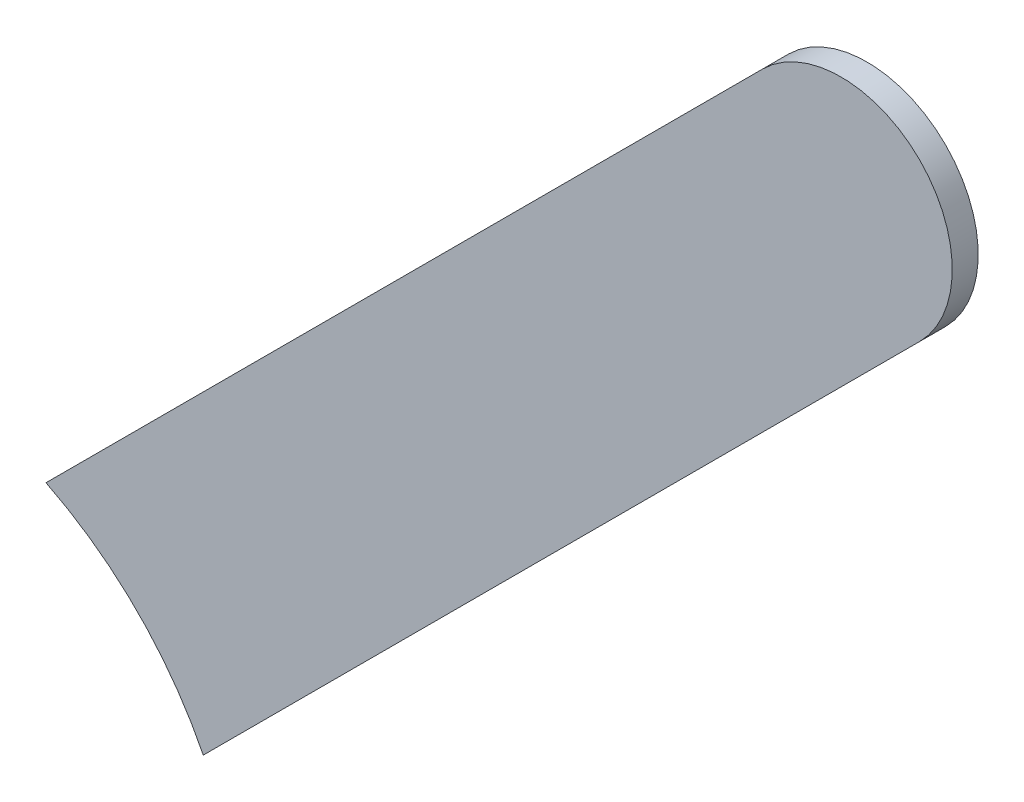
ISO-10303-21;
HEADER;
FILE_DESCRIPTION(('STEP AP214'),'2;1');
FILE_NAME('part.step','',(''),(''),'','','');
FILE_SCHEMA(('AUTOMOTIVE_DESIGN { 1 0 10303 214 1 1 1 1 }'));
ENDSEC;
DATA;
#1=APPLICATION_CONTEXT('core data for automotive mechanical design processes');
#2=APPLICATION_PROTOCOL_DEFINITION('international standard','automotive_design',2000,#1);
#3=PRODUCT_CONTEXT('',#1,'mechanical');
#4=PRODUCT('Part','Part','',(#3));
#5=PRODUCT_RELATED_PRODUCT_CATEGORY('part','',(#4));
#6=PRODUCT_DEFINITION_FORMATION('','',#4);
#7=PRODUCT_DEFINITION_CONTEXT('part definition',#1,'design');
#8=PRODUCT_DEFINITION('design','',#6,#7);
#9=PRODUCT_DEFINITION_SHAPE('','',#8);
#10=(LENGTH_UNIT() NAMED_UNIT(*) SI_UNIT(.MILLI.,.METRE.));
#11=(NAMED_UNIT(*) PLANE_ANGLE_UNIT() SI_UNIT($,.RADIAN.));
#12=(NAMED_UNIT(*) SI_UNIT($,.STERADIAN.) SOLID_ANGLE_UNIT());
#13=UNCERTAINTY_MEASURE_WITH_UNIT(LENGTH_MEASURE(1.E-05),#10,'distance_accuracy_value','');
#14=(GEOMETRIC_REPRESENTATION_CONTEXT(3) GLOBAL_UNCERTAINTY_ASSIGNED_CONTEXT((#13)) GLOBAL_UNIT_ASSIGNED_CONTEXT((#10,
#11,#12)) REPRESENTATION_CONTEXT('',''));
#15=CARTESIAN_POINT('',(0.,0.,0.));
#16=DIRECTION('',(0.,0.,1.));
#17=DIRECTION('',(1.,0.,0.));
#18=AXIS2_PLACEMENT_3D('',#15,#16,#17);
#19=CARTESIAN_POINT('',(78.831066,-114.561065,1.6));
#20=DIRECTION('',(-0.707106781186548,0.707106781186548,0.));
#21=DIRECTION('',(0.,0.,1.));
#22=AXIS2_PLACEMENT_3D('',#19,#20,#21);
#23=PLANE('',#22);
#24=DIRECTION('',(0.,0.,1.));
#25=VECTOR('',#24,1.);
#26=CARTESIAN_POINT('',(80.116066,-113.276065,1.6));
#27=LINE('',#26,#25);
#28=CARTESIAN_POINT('',(80.116066,-113.276065,1.6));
#29=VERTEX_POINT('',#28);
#30=CARTESIAN_POINT('',(80.116066,-113.276065,1.635));
#31=VERTEX_POINT('',#30);
#32=EDGE_CURVE('E11',#29,#31,#27,.T.);
#33=ORIENTED_EDGE('',*,*,#32,.T.);
#34=DIRECTION('',(0.707106781186548,0.707106781186548,0.));
#35=VECTOR('',#34,1.);
#36=CARTESIAN_POINT('',(78.831066,-114.561065,1.635));
#37=LINE('',#36,#35);
#38=CARTESIAN_POINT('',(79.149754725313,-114.2423762746,1.635));
#39=VERTEX_POINT('',#38);
#40=EDGE_CURVE('E25',#39,#31,#37,.T.);
#41=ORIENTED_EDGE('',*,*,#40,.F.);
#42=DIRECTION('',(0.,0.,-1.));
#43=VECTOR('',#42,1.);
#44=CARTESIAN_POINT('',(79.149754725317,-114.2423762746,-0.045));
#45=LINE('',#44,#43);
#46=CARTESIAN_POINT('',(79.149754725313,-114.2423762746,1.6));
#47=VERTEX_POINT('',#46);
#48=EDGE_CURVE('E73',#39,#47,#45,.T.);
#49=ORIENTED_EDGE('',*,*,#48,.T.);
#50=DIRECTION('',(0.707106781186548,0.707106781186548,0.));
#51=VECTOR('',#50,1.);
#52=CARTESIAN_POINT('',(78.831066,-114.561065,1.6));
#53=LINE('',#52,#51);
#54=EDGE_CURVE('E106',#47,#29,#53,.T.);
#55=ORIENTED_EDGE('',*,*,#54,.T.);
#56=EDGE_LOOP('',(#33,#41,#49,#55));
#57=FACE_BOUND('',#56,.T.);
#58=ADVANCED_FACE('F17',(#57),#23,.F.);
#59=CARTESIAN_POINT('',(80.0099995,-113.1699985,1.6));
#60=DIRECTION('',(0.,0.,-1.));
#61=DIRECTION('',(0.707106781186548,-0.707106781186548,0.));
#62=AXIS2_PLACEMENT_3D('',#59,#60,#61);
#63=CYLINDRICAL_SURFACE('',#62,0.150000682813);
#64=CARTESIAN_POINT('',(80.0099995,-113.1699985,1.6));
#65=DIRECTION('',(0.,0.,1.));
#66=DIRECTION('',(0.707106781186548,-0.707106781186548,0.));
#67=AXIS2_PLACEMENT_3D('',#64,#65,#66);
#68=CIRCLE('',#67,0.150000682813);
#69=CARTESIAN_POINT('',(79.903933,-113.063932,1.6));
#70=VERTEX_POINT('',#69);
#71=EDGE_CURVE('E76',#29,#70,#68,.T.);
#72=ORIENTED_EDGE('',*,*,#71,.T.);
#73=DIRECTION('',(0.,0.,1.));
#74=VECTOR('',#73,1.);
#75=CARTESIAN_POINT('',(79.903933,-113.063932,1.6));
#76=LINE('',#75,#74);
#77=CARTESIAN_POINT('',(79.903933,-113.063932,1.635));
#78=VERTEX_POINT('',#77);
#79=EDGE_CURVE('E87',#70,#78,#76,.T.);
#80=ORIENTED_EDGE('',*,*,#79,.T.);
#81=CARTESIAN_POINT('',(80.0099995,-113.1699985,1.635));
#82=DIRECTION('',(0.,0.,1.));
#83=DIRECTION('',(0.707106781186548,-0.707106781186548,0.));
#84=AXIS2_PLACEMENT_3D('',#81,#82,#83);
#85=CIRCLE('',#84,0.150000682813);
#86=EDGE_CURVE('E82',#31,#78,#85,.T.);
#87=ORIENTED_EDGE('',*,*,#86,.F.);
#88=ORIENTED_EDGE('',*,*,#32,.F.);
#89=EDGE_LOOP('',(#72,#80,#87,#88));
#90=FACE_BOUND('',#89,.T.);
#91=ADVANCED_FACE('F118',(#90),#63,.T.);
#92=CARTESIAN_POINT('',(79.903933,-113.063932,1.635));
#93=DIRECTION('',(0.,0.,1.));
#94=DIRECTION('',(1.,0.,0.));
#95=AXIS2_PLACEMENT_3D('',#92,#93,#94);
#96=PLANE('',#95);
#97=ORIENTED_EDGE('',*,*,#86,.T.);
#98=DIRECTION('',(-0.707106781186548,-0.707106781186548,0.));
#99=VECTOR('',#98,1.);
#100=CARTESIAN_POINT('',(79.903933,-113.063932,1.635));
#101=LINE('',#100,#99);
#102=CARTESIAN_POINT('',(78.937621392493,-114.0302436075,1.635));
#103=VERTEX_POINT('',#102);
#104=EDGE_CURVE('E79',#78,#103,#101,.T.);
#105=ORIENTED_EDGE('',*,*,#104,.T.);
#106=CARTESIAN_POINT('',(78.725,-114.454999,1.635));
#107=DIRECTION('',(0.,0.,-1.));
#108=DIRECTION('',(0.,-1.,0.));
#109=AXIS2_PLACEMENT_3D('',#106,#107,#108);
#110=CIRCLE('',#109,0.475);
#111=EDGE_CURVE('E67',#103,#39,#110,.T.);
#112=ORIENTED_EDGE('',*,*,#111,.T.);
#113=ORIENTED_EDGE('',*,*,#40,.T.);
#114=EDGE_LOOP('',(#97,#105,#112,#113));
#115=FACE_BOUND('',#114,.T.);
#116=ADVANCED_FACE('F80',(#115),#96,.T.);
#117=CARTESIAN_POINT('',(78.725,-114.454999,-0.045));
#118=DIRECTION('',(0.,0.,-1.));
#119=DIRECTION('',(0.,-1.,0.));
#120=AXIS2_PLACEMENT_3D('',#117,#118,#119);
#121=CYLINDRICAL_SURFACE('',#120,0.475);
#122=ORIENTED_EDGE('',*,*,#111,.F.);
#123=DIRECTION('',(0.,0.,-1.));
#124=VECTOR('',#123,1.);
#125=CARTESIAN_POINT('',(78.937621392495,-114.0302436075,-0.045));
#126=LINE('',#125,#124);
#127=CARTESIAN_POINT('',(78.937621392493,-114.0302436075,1.6));
#128=VERTEX_POINT('',#127);
#129=EDGE_CURVE('E72',#103,#128,#126,.T.);
#130=ORIENTED_EDGE('',*,*,#129,.T.);
#131=CARTESIAN_POINT('',(78.725,-114.454999,1.6));
#132=DIRECTION('',(0.,0.,-1.));
#133=DIRECTION('',(0.,-1.,0.));
#134=AXIS2_PLACEMENT_3D('',#131,#132,#133);
#135=CIRCLE('',#134,0.475);
#136=EDGE_CURVE('E108',#128,#47,#135,.T.);
#137=ORIENTED_EDGE('',*,*,#136,.T.);
#138=ORIENTED_EDGE('',*,*,#48,.F.);
#139=EDGE_LOOP('',(#122,#130,#137,#138));
#140=FACE_BOUND('',#139,.T.);
#141=ADVANCED_FACE('F69',(#140),#121,.F.);
#142=CARTESIAN_POINT('',(79.903933,-113.063932,1.6));
#143=DIRECTION('',(0.,0.,1.));
#144=DIRECTION('',(1.,0.,0.));
#145=AXIS2_PLACEMENT_3D('',#142,#143,#144);
#146=PLANE('',#145);
#147=ORIENTED_EDGE('',*,*,#54,.F.);
#148=ORIENTED_EDGE('',*,*,#136,.F.);
#149=DIRECTION('',(-0.707106781186548,-0.707106781186548,0.));
#150=VECTOR('',#149,1.);
#151=CARTESIAN_POINT('',(79.903933,-113.063932,1.6));
#152=LINE('',#151,#150);
#153=EDGE_CURVE('E92',#70,#128,#152,.T.);
#154=ORIENTED_EDGE('',*,*,#153,.F.);
#155=ORIENTED_EDGE('',*,*,#71,.F.);
#156=EDGE_LOOP('',(#147,#148,#154,#155));
#157=FACE_BOUND('',#156,.T.);
#158=ADVANCED_FACE('F122',(#157),#146,.F.);
#159=CARTESIAN_POINT('',(79.903933,-113.063932,1.6));
#160=DIRECTION('',(0.707106781186548,-0.707106781186548,0.));
#161=DIRECTION('',(0.,0.,-1.));
#162=AXIS2_PLACEMENT_3D('',#159,#160,#161);
#163=PLANE('',#162);
#164=ORIENTED_EDGE('',*,*,#129,.F.);
#165=ORIENTED_EDGE('',*,*,#104,.F.);
#166=ORIENTED_EDGE('',*,*,#79,.F.);
#167=ORIENTED_EDGE('',*,*,#153,.T.);
#168=EDGE_LOOP('',(#164,#165,#166,#167));
#169=FACE_BOUND('',#168,.T.);
#170=ADVANCED_FACE('F90',(#169),#163,.F.);
#171=CLOSED_SHELL('',(#58,#91,#116,#141,#158,#170));
#172=MANIFOLD_SOLID_BREP('B1',#171);
#173=ADVANCED_BREP_SHAPE_REPRESENTATION('',(#18,#172),#14);
#174=SHAPE_DEFINITION_REPRESENTATION(#9,#173);
ENDSEC;
END-ISO-10303-21;
